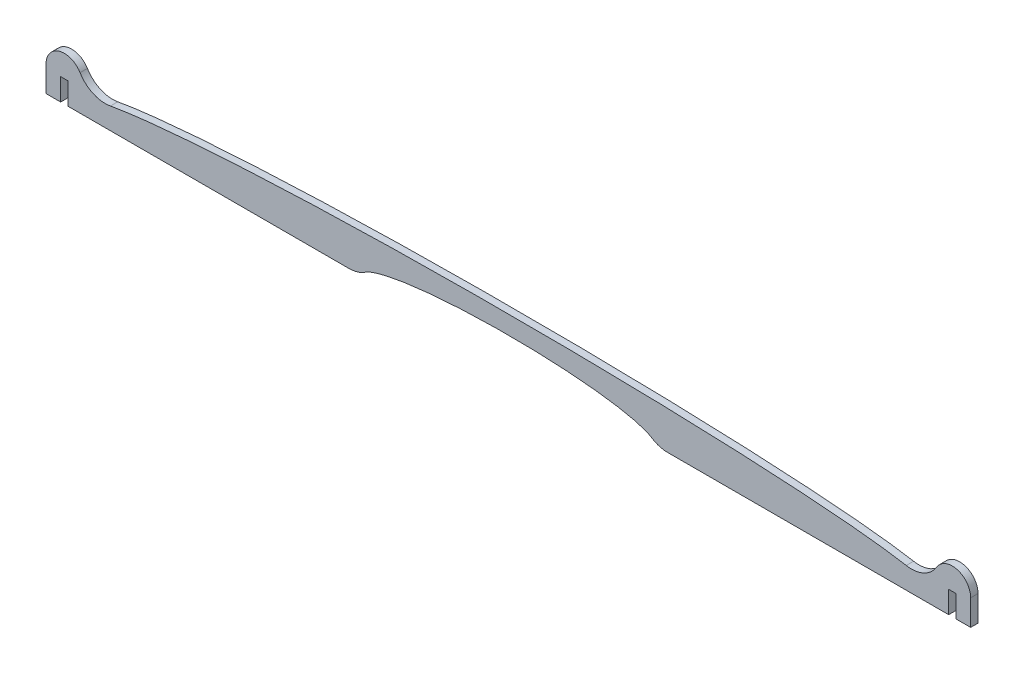
ISO-10303-21;
HEADER;
FILE_DESCRIPTION(('STEP AP214'),'2;1');
FILE_NAME('part.step','',(''),(''),'','','');
FILE_SCHEMA(('AUTOMOTIVE_DESIGN { 1 0 10303 214 1 1 1 1 }'));
ENDSEC;
DATA;
#1=APPLICATION_CONTEXT('core data for automotive mechanical design processes');
#2=APPLICATION_PROTOCOL_DEFINITION('international standard','automotive_design',2000,#1);
#3=PRODUCT_CONTEXT('',#1,'mechanical');
#4=PRODUCT('Part','Part','',(#3));
#5=PRODUCT_RELATED_PRODUCT_CATEGORY('part','',(#4));
#6=PRODUCT_DEFINITION_FORMATION('','',#4);
#7=PRODUCT_DEFINITION_CONTEXT('part definition',#1,'design');
#8=PRODUCT_DEFINITION('design','',#6,#7);
#9=PRODUCT_DEFINITION_SHAPE('','',#8);
#10=(LENGTH_UNIT() NAMED_UNIT(*) SI_UNIT(.MILLI.,.METRE.));
#11=(NAMED_UNIT(*) PLANE_ANGLE_UNIT() SI_UNIT($,.RADIAN.));
#12=(NAMED_UNIT(*) SI_UNIT($,.STERADIAN.) SOLID_ANGLE_UNIT());
#13=UNCERTAINTY_MEASURE_WITH_UNIT(LENGTH_MEASURE(1.E-05),#10,'distance_accuracy_value','');
#14=(GEOMETRIC_REPRESENTATION_CONTEXT(3) GLOBAL_UNCERTAINTY_ASSIGNED_CONTEXT((#13)) GLOBAL_UNIT_ASSIGNED_CONTEXT((#10,
#11,#12)) REPRESENTATION_CONTEXT('',''));
#15=CARTESIAN_POINT('',(0.,0.,0.));
#16=DIRECTION('',(0.,0.,1.));
#17=DIRECTION('',(1.,0.,0.));
#18=AXIS2_PLACEMENT_3D('',#15,#16,#17);
#19=CARTESIAN_POINT('',(0.,4.76250000000008,3.175));
#20=DIRECTION('',(0.,0.,1.));
#21=DIRECTION('',(-1.,0.,0.));
#22=AXIS2_PLACEMENT_3D('',#19,#20,#21);
#23=ELLIPSE('',#22,184.15,12.7);
#24=DIRECTION('',(0.,0.,-1.));
#25=VECTOR('',#24,1.);
#26=SURFACE_OF_LINEAR_EXTRUSION('',#23,#25);
#27=CARTESIAN_POINT('',(172.145584931808,9.27282378381999,3.175));
#28=VERTEX_POINT('',#27);
#29=CARTESIAN_POINT('',(-172.145584931808,9.27282378381973,3.175));
#30=VERTEX_POINT('',#29);
#31=EDGE_CURVE('E187',#28,#30,#23,.T.);
#32=ORIENTED_EDGE('',*,*,#31,.F.);
#33=DIRECTION('',(0.,0.,-1.));
#34=VECTOR('',#33,1.);
#35=CARTESIAN_POINT('',(172.145584931808,9.27282378381999,3.175));
#36=LINE('',#35,#34);
#37=CARTESIAN_POINT('',(172.145584931808,9.27282378381999,0.));
#38=VERTEX_POINT('',#37);
#39=EDGE_CURVE('E316',#28,#38,#36,.T.);
#40=ORIENTED_EDGE('',*,*,#39,.T.);
#41=CARTESIAN_POINT('',(0.,4.76250000000008,0.));
#42=DIRECTION('',(0.,0.,1.));
#43=DIRECTION('',(-1.,0.,0.));
#44=AXIS2_PLACEMENT_3D('',#41,#42,#43);
#45=ELLIPSE('',#44,184.15,12.7);
#46=CARTESIAN_POINT('',(-172.145584931808,9.27282378381973,0.));
#47=VERTEX_POINT('',#46);
#48=EDGE_CURVE('E330',#38,#47,#45,.T.);
#49=ORIENTED_EDGE('',*,*,#48,.T.);
#50=DIRECTION('',(0.,0.,-1.));
#51=VECTOR('',#50,1.);
#52=CARTESIAN_POINT('',(-172.145584931808,9.27282378381973,0.));
#53=LINE('',#52,#51);
#54=EDGE_CURVE('E314',#47,#30,#53,.F.);
#55=ORIENTED_EDGE('',*,*,#54,.T.);
#56=EDGE_LOOP('',(#32,#40,#49,#55));
#57=FACE_BOUND('',#56,.T.);
#58=ADVANCED_FACE('F36',(#57),#26,.F.);
#59=CARTESIAN_POINT('',(-192.0875,11.1125,3.175));
#60=DIRECTION('',(0.,0.,-1.));
#61=DIRECTION('',(-1.,0.,0.));
#62=AXIS2_PLACEMENT_3D('',#59,#60,#61);
#63=CYLINDRICAL_SURFACE('',#62,7.93749999999999);
#64=CARTESIAN_POINT('',(-192.0875,11.1125,3.175));
#65=DIRECTION('',(0.,0.,1.));
#66=DIRECTION('',(-1.,0.,0.));
#67=AXIS2_PLACEMENT_3D('',#64,#65,#66);
#68=CIRCLE('',#67,7.93749999999999);
#69=CARTESIAN_POINT('',(-185.289985800573,15.2110005744278,3.175));
#70=VERTEX_POINT('',#69);
#71=CARTESIAN_POINT('',(-200.025,11.1124999999999,3.175));
#72=VERTEX_POINT('',#71);
#73=EDGE_CURVE('E175',#70,#72,#68,.T.);
#74=ORIENTED_EDGE('',*,*,#73,.F.);
#75=DIRECTION('',(0.,0.,-1.));
#76=VECTOR('',#75,1.);
#77=CARTESIAN_POINT('',(-185.289985800573,15.2110005744278,3.175));
#78=LINE('',#77,#76);
#79=CARTESIAN_POINT('',(-185.289985800573,15.2110005744278,0.));
#80=VERTEX_POINT('',#79);
#81=EDGE_CURVE('E320',#70,#80,#78,.T.);
#82=ORIENTED_EDGE('',*,*,#81,.T.);
#83=CARTESIAN_POINT('',(-192.0875,11.1125,0.));
#84=DIRECTION('',(0.,0.,1.));
#85=DIRECTION('',(-1.,0.,0.));
#86=AXIS2_PLACEMENT_3D('',#83,#84,#85);
#87=CIRCLE('',#86,7.93749999999999);
#88=CARTESIAN_POINT('',(-200.025,11.1124999999999,0.));
#89=VERTEX_POINT('',#88);
#90=EDGE_CURVE('E193',#80,#89,#87,.T.);
#91=ORIENTED_EDGE('',*,*,#90,.T.);
#92=DIRECTION('',(0.,0.,-1.));
#93=VECTOR('',#92,1.);
#94=CARTESIAN_POINT('',(-200.025,11.1124999999999,3.175));
#95=LINE('',#94,#93);
#96=EDGE_CURVE('E190',#72,#89,#95,.T.);
#97=ORIENTED_EDGE('',*,*,#96,.F.);
#98=EDGE_LOOP('',(#74,#82,#91,#97));
#99=FACE_BOUND('',#98,.T.);
#100=ADVANCED_FACE('F191',(#99),#63,.T.);
#101=CARTESIAN_POINT('',(-200.025,0.,3.175));
#102=DIRECTION('',(1.,0.,0.));
#103=DIRECTION('',(0.,0.,-1.));
#104=AXIS2_PLACEMENT_3D('',#101,#102,#103);
#105=PLANE('',#104);
#106=DIRECTION('',(0.,-1.,0.));
#107=VECTOR('',#106,1.);
#108=CARTESIAN_POINT('',(-200.025,0.,0.));
#109=LINE('',#108,#107);
#110=CARTESIAN_POINT('',(-200.025,0.,0.));
#111=VERTEX_POINT('',#110);
#112=EDGE_CURVE('E356',#89,#111,#109,.T.);
#113=ORIENTED_EDGE('',*,*,#112,.T.);
#114=DIRECTION('',(0.,0.,-1.));
#115=VECTOR('',#114,1.);
#116=CARTESIAN_POINT('',(-200.025,0.,3.175));
#117=LINE('',#116,#115);
#118=CARTESIAN_POINT('',(-200.025,0.,3.175));
#119=VERTEX_POINT('',#118);
#120=EDGE_CURVE('E197',#119,#111,#117,.T.);
#121=ORIENTED_EDGE('',*,*,#120,.F.);
#122=DIRECTION('',(0.,-1.,0.));
#123=VECTOR('',#122,1.);
#124=CARTESIAN_POINT('',(-200.025,0.,3.175));
#125=LINE('',#124,#123);
#126=EDGE_CURVE('E180',#72,#119,#125,.T.);
#127=ORIENTED_EDGE('',*,*,#126,.F.);
#128=ORIENTED_EDGE('',*,*,#96,.T.);
#129=EDGE_LOOP('',(#113,#121,#127,#128));
#130=FACE_BOUND('',#129,.T.);
#131=ADVANCED_FACE('F199',(#130),#105,.F.);
#132=CARTESIAN_POINT('',(-200.025,0.,3.175));
#133=DIRECTION('',(0.,1.,0.));
#134=DIRECTION('',(-1.,0.,0.));
#135=AXIS2_PLACEMENT_3D('',#132,#133,#134);
#136=PLANE('',#135);
#137=DIRECTION('',(1.,0.,0.));
#138=VECTOR('',#137,1.);
#139=CARTESIAN_POINT('',(-200.025,0.,0.));
#140=LINE('',#139,#138);
#141=CARTESIAN_POINT('',(-193.675,0.,0.));
#142=VERTEX_POINT('',#141);
#143=EDGE_CURVE('E358',#111,#142,#140,.T.);
#144=ORIENTED_EDGE('',*,*,#143,.T.);
#145=DIRECTION('',(0.,0.,-1.));
#146=VECTOR('',#145,1.);
#147=CARTESIAN_POINT('',(-193.675,0.,3.175));
#148=LINE('',#147,#146);
#149=CARTESIAN_POINT('',(-193.675,0.,3.175));
#150=VERTEX_POINT('',#149);
#151=EDGE_CURVE('E294',#150,#142,#148,.T.);
#152=ORIENTED_EDGE('',*,*,#151,.F.);
#153=DIRECTION('',(1.,0.,0.));
#154=VECTOR('',#153,1.);
#155=CARTESIAN_POINT('',(-200.025,0.,3.175));
#156=LINE('',#155,#154);
#157=EDGE_CURVE('E202',#119,#150,#156,.T.);
#158=ORIENTED_EDGE('',*,*,#157,.F.);
#159=ORIENTED_EDGE('',*,*,#120,.T.);
#160=EDGE_LOOP('',(#144,#152,#158,#159));
#161=FACE_BOUND('',#160,.T.);
#162=ADVANCED_FACE('F242',(#161),#136,.F.);
#163=CARTESIAN_POINT('',(-193.675,0.,3.175));
#164=DIRECTION('',(-1.,0.,0.));
#165=DIRECTION('',(0.,0.,1.));
#166=AXIS2_PLACEMENT_3D('',#163,#164,#165);
#167=PLANE('',#166);
#168=DIRECTION('',(0.,1.,0.));
#169=VECTOR('',#168,1.);
#170=CARTESIAN_POINT('',(-193.675,0.,0.));
#171=LINE('',#170,#169);
#172=CARTESIAN_POINT('',(-193.675,9.52500000000022,0.));
#173=VERTEX_POINT('',#172);
#174=EDGE_CURVE('E360',#142,#173,#171,.T.);
#175=ORIENTED_EDGE('',*,*,#174,.T.);
#176=DIRECTION('',(0.,0.,-1.));
#177=VECTOR('',#176,1.);
#178=CARTESIAN_POINT('',(-193.675,9.52500000000022,3.175));
#179=LINE('',#178,#177);
#180=CARTESIAN_POINT('',(-193.675,9.52500000000022,3.175));
#181=VERTEX_POINT('',#180);
#182=EDGE_CURVE('E291',#181,#173,#179,.T.);
#183=ORIENTED_EDGE('',*,*,#182,.F.);
#184=DIRECTION('',(0.,1.,0.));
#185=VECTOR('',#184,1.);
#186=CARTESIAN_POINT('',(-193.675,0.,3.175));
#187=LINE('',#186,#185);
#188=EDGE_CURVE('E204',#150,#181,#187,.T.);
#189=ORIENTED_EDGE('',*,*,#188,.F.);
#190=ORIENTED_EDGE('',*,*,#151,.T.);
#191=EDGE_LOOP('',(#175,#183,#189,#190));
#192=FACE_BOUND('',#191,.T.);
#193=ADVANCED_FACE('F238',(#192),#167,.F.);
#194=CARTESIAN_POINT('',(-193.675,9.52500000000022,3.175));
#195=DIRECTION('',(0.,1.,0.));
#196=DIRECTION('',(-1.,0.,0.));
#197=AXIS2_PLACEMENT_3D('',#194,#195,#196);
#198=PLANE('',#197);
#199=DIRECTION('',(1.,0.,0.));
#200=VECTOR('',#199,1.);
#201=CARTESIAN_POINT('',(-193.675,9.52500000000022,0.));
#202=LINE('',#201,#200);
#203=CARTESIAN_POINT('',(-190.5,9.525,0.));
#204=VERTEX_POINT('',#203);
#205=EDGE_CURVE('E362',#173,#204,#202,.T.);
#206=ORIENTED_EDGE('',*,*,#205,.T.);
#207=DIRECTION('',(0.,0.,-1.));
#208=VECTOR('',#207,1.);
#209=CARTESIAN_POINT('',(-190.5,9.525,3.175));
#210=LINE('',#209,#208);
#211=CARTESIAN_POINT('',(-190.5,9.525,3.175));
#212=VERTEX_POINT('',#211);
#213=EDGE_CURVE('E288',#212,#204,#210,.T.);
#214=ORIENTED_EDGE('',*,*,#213,.F.);
#215=DIRECTION('',(1.,0.,0.));
#216=VECTOR('',#215,1.);
#217=CARTESIAN_POINT('',(-193.675,9.52500000000022,3.175));
#218=LINE('',#217,#216);
#219=EDGE_CURVE('E209',#181,#212,#218,.T.);
#220=ORIENTED_EDGE('',*,*,#219,.F.);
#221=ORIENTED_EDGE('',*,*,#182,.T.);
#222=EDGE_LOOP('',(#206,#214,#220,#221));
#223=FACE_BOUND('',#222,.T.);
#224=ADVANCED_FACE('F234',(#223),#198,.F.);
#225=CARTESIAN_POINT('',(-190.5,9.525,3.175));
#226=DIRECTION('',(1.,0.,0.));
#227=DIRECTION('',(0.,1.,0.));
#228=AXIS2_PLACEMENT_3D('',#225,#226,#227);
#229=PLANE('',#228);
#230=DIRECTION('',(0.,-1.,0.));
#231=VECTOR('',#230,1.);
#232=CARTESIAN_POINT('',(-190.5,9.525,0.));
#233=LINE('',#232,#231);
#234=CARTESIAN_POINT('',(-190.5,0.,0.));
#235=VERTEX_POINT('',#234);
#236=EDGE_CURVE('E364',#204,#235,#233,.T.);
#237=ORIENTED_EDGE('',*,*,#236,.T.);
#238=DIRECTION('',(0.,0.,-1.));
#239=VECTOR('',#238,1.);
#240=CARTESIAN_POINT('',(-190.5,0.,3.175));
#241=LINE('',#240,#239);
#242=CARTESIAN_POINT('',(-190.5,0.,3.175));
#243=VERTEX_POINT('',#242);
#244=EDGE_CURVE('E285',#243,#235,#241,.T.);
#245=ORIENTED_EDGE('',*,*,#244,.F.);
#246=DIRECTION('',(0.,-1.,0.));
#247=VECTOR('',#246,1.);
#248=CARTESIAN_POINT('',(-190.5,9.525,3.175));
#249=LINE('',#248,#247);
#250=EDGE_CURVE('E211',#212,#243,#249,.T.);
#251=ORIENTED_EDGE('',*,*,#250,.F.);
#252=ORIENTED_EDGE('',*,*,#213,.T.);
#253=EDGE_LOOP('',(#237,#245,#251,#252));
#254=FACE_BOUND('',#253,.T.);
#255=ADVANCED_FACE('F231',(#254),#229,.F.);
#256=CARTESIAN_POINT('',(-190.5,0.,3.175));
#257=DIRECTION('',(0.,1.,0.));
#258=DIRECTION('',(0.,0.,1.));
#259=AXIS2_PLACEMENT_3D('',#256,#257,#258);
#260=PLANE('',#259);
#261=DIRECTION('',(1.,0.,0.));
#262=VECTOR('',#261,1.);
#263=CARTESIAN_POINT('',(-190.5,0.,0.));
#264=LINE('',#263,#262);
#265=CARTESIAN_POINT('',(-68.9324959799146,0.,0.));
#266=VERTEX_POINT('',#265);
#267=EDGE_CURVE('E366',#235,#266,#264,.T.);
#268=ORIENTED_EDGE('',*,*,#267,.T.);
#269=DIRECTION('',(0.,0.,-1.));
#270=VECTOR('',#269,1.);
#271=CARTESIAN_POINT('',(-68.9324959799145,0.,3.175));
#272=LINE('',#271,#270);
#273=CARTESIAN_POINT('',(-68.9324959799146,0.,3.175));
#274=VERTEX_POINT('',#273);
#275=EDGE_CURVE('E59',#266,#274,#272,.F.);
#276=ORIENTED_EDGE('',*,*,#275,.T.);
#277=DIRECTION('',(1.,0.,0.));
#278=VECTOR('',#277,1.);
#279=CARTESIAN_POINT('',(-190.5,0.,3.175));
#280=LINE('',#279,#278);
#281=EDGE_CURVE('E213',#243,#274,#280,.T.);
#282=ORIENTED_EDGE('',*,*,#281,.F.);
#283=ORIENTED_EDGE('',*,*,#244,.T.);
#284=EDGE_LOOP('',(#268,#276,#282,#283));
#285=FACE_BOUND('',#284,.T.);
#286=ADVANCED_FACE('F226',(#285),#260,.F.);
#287=CARTESIAN_POINT('',(0.,0.,3.175));
#288=DIRECTION('',(0.,0.,-1.));
#289=DIRECTION('',(-1.,0.,0.));
#290=AXIS2_PLACEMENT_3D('',#287,#288,#289);
#291=ELLIPSE('',#290,63.5,9.525);
#292=DIRECTION('',(0.,0.,-1.));
#293=VECTOR('',#292,1.);
#294=SURFACE_OF_LINEAR_EXTRUSION('',#291,#293);
#295=CARTESIAN_POINT('',(0.,0.,0.));
#296=DIRECTION('',(0.,0.,-1.));
#297=DIRECTION('',(-1.,0.,0.));
#298=AXIS2_PLACEMENT_3D('',#295,#296,#297);
#299=ELLIPSE('',#298,63.5,9.525);
#300=CARTESIAN_POINT('',(-61.9270250788543,2.10691841556961,0.));
#301=VERTEX_POINT('',#300);
#302=CARTESIAN_POINT('',(61.9270250788543,2.1069184155696,0.));
#303=VERTEX_POINT('',#302);
#304=EDGE_CURVE('E368',#301,#303,#299,.T.);
#305=ORIENTED_EDGE('',*,*,#304,.T.);
#306=DIRECTION('',(0.,0.,-1.));
#307=VECTOR('',#306,1.);
#308=CARTESIAN_POINT('',(61.9270250788543,2.1069184155696,0.));
#309=LINE('',#308,#307);
#310=CARTESIAN_POINT('',(61.9270250788543,2.1069184155696,3.175));
#311=VERTEX_POINT('',#310);
#312=EDGE_CURVE('E307',#303,#311,#309,.F.);
#313=ORIENTED_EDGE('',*,*,#312,.T.);
#314=CARTESIAN_POINT('',(-61.9270250788543,2.10691841556961,3.175));
#315=VERTEX_POINT('',#314);
#316=EDGE_CURVE('E215',#315,#311,#291,.T.);
#317=ORIENTED_EDGE('',*,*,#316,.F.);
#318=DIRECTION('',(0.,0.,-1.));
#319=VECTOR('',#318,1.);
#320=CARTESIAN_POINT('',(-61.9270250788543,2.10691841556961,3.175));
#321=LINE('',#320,#319);
#322=EDGE_CURVE('E304',#315,#301,#321,.T.);
#323=ORIENTED_EDGE('',*,*,#322,.T.);
#324=EDGE_LOOP('',(#305,#313,#317,#323));
#325=FACE_BOUND('',#324,.T.);
#326=ADVANCED_FACE('F221',(#325),#294,.F.);
#327=CARTESIAN_POINT('',(190.5,0.,3.175));
#328=DIRECTION('',(0.,1.,0.));
#329=DIRECTION('',(-1.,0.,0.));
#330=AXIS2_PLACEMENT_3D('',#327,#328,#329);
#331=PLANE('',#330);
#332=DIRECTION('',(1.,0.,0.));
#333=VECTOR('',#332,1.);
#334=CARTESIAN_POINT('',(190.5,0.,3.175));
#335=LINE('',#334,#333);
#336=CARTESIAN_POINT('',(68.9324959799145,0.,3.175));
#337=VERTEX_POINT('',#336);
#338=CARTESIAN_POINT('',(190.5,0.,3.175));
#339=VERTEX_POINT('',#338);
#340=EDGE_CURVE('E218',#337,#339,#335,.T.);
#341=ORIENTED_EDGE('',*,*,#340,.F.);
#342=DIRECTION('',(0.,0.,-1.));
#343=VECTOR('',#342,1.);
#344=CARTESIAN_POINT('',(68.9324959799145,0.,3.175));
#345=LINE('',#344,#343);
#346=CARTESIAN_POINT('',(68.9324959799145,0.,0.));
#347=VERTEX_POINT('',#346);
#348=EDGE_CURVE('E196',#337,#347,#345,.T.);
#349=ORIENTED_EDGE('',*,*,#348,.T.);
#350=DIRECTION('',(1.,0.,0.));
#351=VECTOR('',#350,1.);
#352=CARTESIAN_POINT('',(190.5,0.,0.));
#353=LINE('',#352,#351);
#354=CARTESIAN_POINT('',(190.5,0.,0.));
#355=VERTEX_POINT('',#354);
#356=EDGE_CURVE('E371',#347,#355,#353,.T.);
#357=ORIENTED_EDGE('',*,*,#356,.T.);
#358=DIRECTION('',(0.,0.,-1.));
#359=VECTOR('',#358,1.);
#360=CARTESIAN_POINT('',(190.5,0.,3.175));
#361=LINE('',#360,#359);
#362=EDGE_CURVE('E282',#339,#355,#361,.T.);
#363=ORIENTED_EDGE('',*,*,#362,.F.);
#364=EDGE_LOOP('',(#341,#349,#357,#363));
#365=FACE_BOUND('',#364,.T.);
#366=ADVANCED_FACE('F225',(#365),#331,.F.);
#367=CARTESIAN_POINT('',(190.5,9.52500000000022,3.175));
#368=DIRECTION('',(-1.,0.,0.));
#369=DIRECTION('',(0.,-1.,0.));
#370=AXIS2_PLACEMENT_3D('',#367,#368,#369);
#371=PLANE('',#370);
#372=DIRECTION('',(0.,1.,0.));
#373=VECTOR('',#372,1.);
#374=CARTESIAN_POINT('',(190.5,9.52500000000022,0.));
#375=LINE('',#374,#373);
#376=CARTESIAN_POINT('',(190.5,9.52500000000022,0.));
#377=VERTEX_POINT('',#376);
#378=EDGE_CURVE('E373',#355,#377,#375,.T.);
#379=ORIENTED_EDGE('',*,*,#378,.T.);
#380=DIRECTION('',(0.,0.,-1.));
#381=VECTOR('',#380,1.);
#382=CARTESIAN_POINT('',(190.5,9.52500000000022,3.175));
#383=LINE('',#382,#381);
#384=CARTESIAN_POINT('',(190.5,9.52500000000022,3.175));
#385=VERTEX_POINT('',#384);
#386=EDGE_CURVE('E279',#385,#377,#383,.T.);
#387=ORIENTED_EDGE('',*,*,#386,.F.);
#388=DIRECTION('',(0.,1.,0.));
#389=VECTOR('',#388,1.);
#390=CARTESIAN_POINT('',(190.5,9.52500000000022,3.175));
#391=LINE('',#390,#389);
#392=EDGE_CURVE('E426',#339,#385,#391,.T.);
#393=ORIENTED_EDGE('',*,*,#392,.F.);
#394=ORIENTED_EDGE('',*,*,#362,.T.);
#395=EDGE_LOOP('',(#379,#387,#393,#394));
#396=FACE_BOUND('',#395,.T.);
#397=ADVANCED_FACE('F407',(#396),#371,.F.);
#398=CARTESIAN_POINT('',(193.675,9.52500000000022,3.175));
#399=DIRECTION('',(0.,1.,0.));
#400=DIRECTION('',(0.,0.,1.));
#401=AXIS2_PLACEMENT_3D('',#398,#399,#400);
#402=PLANE('',#401);
#403=DIRECTION('',(1.,0.,0.));
#404=VECTOR('',#403,1.);
#405=CARTESIAN_POINT('',(193.675,9.52500000000022,0.));
#406=LINE('',#405,#404);
#407=CARTESIAN_POINT('',(193.675,9.52500000000022,0.));
#408=VERTEX_POINT('',#407);
#409=EDGE_CURVE('E375',#377,#408,#406,.T.);
#410=ORIENTED_EDGE('',*,*,#409,.T.);
#411=DIRECTION('',(0.,0.,-1.));
#412=VECTOR('',#411,1.);
#413=CARTESIAN_POINT('',(193.675,9.52500000000022,3.175));
#414=LINE('',#413,#412);
#415=CARTESIAN_POINT('',(193.675,9.52500000000022,3.175));
#416=VERTEX_POINT('',#415);
#417=EDGE_CURVE('E276',#416,#408,#414,.T.);
#418=ORIENTED_EDGE('',*,*,#417,.F.);
#419=DIRECTION('',(1.,0.,0.));
#420=VECTOR('',#419,1.);
#421=CARTESIAN_POINT('',(193.675,9.52500000000022,3.175));
#422=LINE('',#421,#420);
#423=EDGE_CURVE('E422',#385,#416,#422,.T.);
#424=ORIENTED_EDGE('',*,*,#423,.F.);
#425=ORIENTED_EDGE('',*,*,#386,.T.);
#426=EDGE_LOOP('',(#410,#418,#424,#425));
#427=FACE_BOUND('',#426,.T.);
#428=ADVANCED_FACE('F404',(#427),#402,.F.);
#429=CARTESIAN_POINT('',(193.675,0.,3.175));
#430=DIRECTION('',(1.,0.,0.));
#431=DIRECTION('',(0.,0.,-1.));
#432=AXIS2_PLACEMENT_3D('',#429,#430,#431);
#433=PLANE('',#432);
#434=DIRECTION('',(0.,-1.,0.));
#435=VECTOR('',#434,1.);
#436=CARTESIAN_POINT('',(193.675,0.,0.));
#437=LINE('',#436,#435);
#438=CARTESIAN_POINT('',(193.675,0.,0.));
#439=VERTEX_POINT('',#438);
#440=EDGE_CURVE('E377',#408,#439,#437,.T.);
#441=ORIENTED_EDGE('',*,*,#440,.T.);
#442=DIRECTION('',(0.,0.,-1.));
#443=VECTOR('',#442,1.);
#444=CARTESIAN_POINT('',(193.675,0.,3.175));
#445=LINE('',#444,#443);
#446=CARTESIAN_POINT('',(193.675,0.,3.175));
#447=VERTEX_POINT('',#446);
#448=EDGE_CURVE('E273',#447,#439,#445,.T.);
#449=ORIENTED_EDGE('',*,*,#448,.F.);
#450=DIRECTION('',(0.,-1.,0.));
#451=VECTOR('',#450,1.);
#452=CARTESIAN_POINT('',(193.675,0.,3.175));
#453=LINE('',#452,#451);
#454=EDGE_CURVE('E424',#416,#447,#453,.T.);
#455=ORIENTED_EDGE('',*,*,#454,.F.);
#456=ORIENTED_EDGE('',*,*,#417,.T.);
#457=EDGE_LOOP('',(#441,#449,#455,#456));
#458=FACE_BOUND('',#457,.T.);
#459=ADVANCED_FACE('F401',(#458),#433,.F.);
#460=CARTESIAN_POINT('',(200.025,0.,3.175));
#461=DIRECTION('',(0.,1.,0.));
#462=DIRECTION('',(-1.,0.,0.));
#463=AXIS2_PLACEMENT_3D('',#460,#461,#462);
#464=PLANE('',#463);
#465=DIRECTION('',(1.,0.,0.));
#466=VECTOR('',#465,1.);
#467=CARTESIAN_POINT('',(200.025,0.,0.));
#468=LINE('',#467,#466);
#469=CARTESIAN_POINT('',(200.025,0.,0.));
#470=VERTEX_POINT('',#469);
#471=EDGE_CURVE('E263',#439,#470,#468,.T.);
#472=ORIENTED_EDGE('',*,*,#471,.T.);
#473=DIRECTION('',(0.,0.,-1.));
#474=VECTOR('',#473,1.);
#475=CARTESIAN_POINT('',(200.025,0.,3.175));
#476=LINE('',#475,#474);
#477=CARTESIAN_POINT('',(200.025,0.,3.175));
#478=VERTEX_POINT('',#477);
#479=EDGE_CURVE('E269',#478,#470,#476,.T.);
#480=ORIENTED_EDGE('',*,*,#479,.F.);
#481=DIRECTION('',(1.,0.,0.));
#482=VECTOR('',#481,1.);
#483=CARTESIAN_POINT('',(200.025,0.,3.175));
#484=LINE('',#483,#482);
#485=EDGE_CURVE('E351',#447,#478,#484,.T.);
#486=ORIENTED_EDGE('',*,*,#485,.F.);
#487=ORIENTED_EDGE('',*,*,#448,.T.);
#488=EDGE_LOOP('',(#472,#480,#486,#487));
#489=FACE_BOUND('',#488,.T.);
#490=ADVANCED_FACE('F381',(#489),#464,.F.);
#491=CARTESIAN_POINT('',(200.025,0.,3.175));
#492=DIRECTION('',(-1.,0.,0.));
#493=DIRECTION('',(0.,0.,1.));
#494=AXIS2_PLACEMENT_3D('',#491,#492,#493);
#495=PLANE('',#494);
#496=DIRECTION('',(0.,1.,0.));
#497=VECTOR('',#496,1.);
#498=CARTESIAN_POINT('',(200.025,0.,0.));
#499=LINE('',#498,#497);
#500=CARTESIAN_POINT('',(200.025,11.1124999999999,0.));
#501=VERTEX_POINT('',#500);
#502=EDGE_CURVE('E259',#470,#501,#499,.T.);
#503=ORIENTED_EDGE('',*,*,#502,.T.);
#504=DIRECTION('',(0.,0.,-1.));
#505=VECTOR('',#504,1.);
#506=CARTESIAN_POINT('',(200.025,11.1124999999999,3.175));
#507=LINE('',#506,#505);
#508=CARTESIAN_POINT('',(200.025,11.1124999999999,3.175));
#509=VERTEX_POINT('',#508);
#510=EDGE_CURVE('E267',#509,#501,#507,.T.);
#511=ORIENTED_EDGE('',*,*,#510,.F.);
#512=DIRECTION('',(0.,1.,0.));
#513=VECTOR('',#512,1.);
#514=CARTESIAN_POINT('',(200.025,0.,3.175));
#515=LINE('',#514,#513);
#516=EDGE_CURVE('E348',#478,#509,#515,.T.);
#517=ORIENTED_EDGE('',*,*,#516,.F.);
#518=ORIENTED_EDGE('',*,*,#479,.T.);
#519=EDGE_LOOP('',(#503,#511,#517,#518));
#520=FACE_BOUND('',#519,.T.);
#521=ADVANCED_FACE('F387',(#520),#495,.F.);
#522=CARTESIAN_POINT('',(192.0875,11.1125,3.175));
#523=DIRECTION('',(0.,0.,-1.));
#524=DIRECTION('',(-1.,0.,0.));
#525=AXIS2_PLACEMENT_3D('',#522,#523,#524);
#526=CYLINDRICAL_SURFACE('',#525,7.93749999999999);
#527=CARTESIAN_POINT('',(192.0875,11.1125,0.));
#528=DIRECTION('',(0.,0.,1.));
#529=DIRECTION('',(1.,0.,0.));
#530=AXIS2_PLACEMENT_3D('',#527,#528,#529);
#531=CIRCLE('',#530,7.93749999999999);
#532=CARTESIAN_POINT('',(185.289985800573,15.2110005744279,0.));
#533=VERTEX_POINT('',#532);
#534=EDGE_CURVE('E257',#501,#533,#531,.T.);
#535=ORIENTED_EDGE('',*,*,#534,.T.);
#536=DIRECTION('',(0.,0.,-1.));
#537=VECTOR('',#536,1.);
#538=CARTESIAN_POINT('',(185.289985800573,15.2110005744279,3.175));
#539=LINE('',#538,#537);
#540=CARTESIAN_POINT('',(185.289985800573,15.2110005744279,3.175));
#541=VERTEX_POINT('',#540);
#542=EDGE_CURVE('E51',#533,#541,#539,.F.);
#543=ORIENTED_EDGE('',*,*,#542,.T.);
#544=CARTESIAN_POINT('',(192.0875,11.1125,3.175));
#545=DIRECTION('',(0.,0.,1.));
#546=DIRECTION('',(1.,0.,0.));
#547=AXIS2_PLACEMENT_3D('',#544,#545,#546);
#548=CIRCLE('',#547,7.93749999999999);
#549=EDGE_CURVE('E270',#509,#541,#548,.T.);
#550=ORIENTED_EDGE('',*,*,#549,.F.);
#551=ORIENTED_EDGE('',*,*,#510,.T.);
#552=EDGE_LOOP('',(#535,#543,#550,#551));
#553=FACE_BOUND('',#552,.T.);
#554=ADVANCED_FACE('F388',(#553),#526,.T.);
#555=CARTESIAN_POINT('',(0.,4.76250000000008,3.175));
#556=DIRECTION('',(0.,0.,1.));
#557=DIRECTION('',(1.,0.,0.));
#558=AXIS2_PLACEMENT_3D('',#555,#556,#557);
#559=PLANE('',#558);
#560=ORIENTED_EDGE('',*,*,#316,.T.);
#561=CARTESIAN_POINT('',(68.9324959799145,12.7,3.175));
#562=DIRECTION('',(0.,0.,1.));
#563=DIRECTION('',(1.,0.,0.));
#564=AXIS2_PLACEMENT_3D('',#561,#562,#563);
#565=CIRCLE('',#564,12.7);
#566=EDGE_CURVE('E311',#311,#337,#565,.T.);
#567=ORIENTED_EDGE('',*,*,#566,.T.);
#568=ORIENTED_EDGE('',*,*,#340,.T.);
#569=ORIENTED_EDGE('',*,*,#392,.T.);
#570=ORIENTED_EDGE('',*,*,#423,.T.);
#571=ORIENTED_EDGE('',*,*,#454,.T.);
#572=ORIENTED_EDGE('',*,*,#485,.T.);
#573=ORIENTED_EDGE('',*,*,#516,.T.);
#574=ORIENTED_EDGE('',*,*,#549,.T.);
#575=CARTESIAN_POINT('',(174.413963081489,21.7686014935125,3.175));
#576=DIRECTION('',(0.,0.,1.));
#577=DIRECTION('',(1.,0.,0.));
#578=AXIS2_PLACEMENT_3D('',#575,#576,#577);
#579=CIRCLE('',#578,12.7);
#580=EDGE_CURVE('E324',#541,#28,#579,.F.);
#581=ORIENTED_EDGE('',*,*,#580,.T.);
#582=ORIENTED_EDGE('',*,*,#31,.T.);
#583=CARTESIAN_POINT('',(-174.413963081489,21.7686014935122,3.175));
#584=DIRECTION('',(0.,0.,1.));
#585=DIRECTION('',(1.,0.,0.));
#586=AXIS2_PLACEMENT_3D('',#583,#584,#585);
#587=CIRCLE('',#586,12.7);
#588=EDGE_CURVE('E11',#30,#70,#587,.F.);
#589=ORIENTED_EDGE('',*,*,#588,.T.);
#590=ORIENTED_EDGE('',*,*,#73,.T.);
#591=ORIENTED_EDGE('',*,*,#126,.T.);
#592=ORIENTED_EDGE('',*,*,#157,.T.);
#593=ORIENTED_EDGE('',*,*,#188,.T.);
#594=ORIENTED_EDGE('',*,*,#219,.T.);
#595=ORIENTED_EDGE('',*,*,#250,.T.);
#596=ORIENTED_EDGE('',*,*,#281,.T.);
#597=CARTESIAN_POINT('',(-68.9324959799145,12.7,3.175));
#598=DIRECTION('',(0.,0.,1.));
#599=DIRECTION('',(1.,0.,0.));
#600=AXIS2_PLACEMENT_3D('',#597,#598,#599);
#601=CIRCLE('',#600,12.7);
#602=EDGE_CURVE('E309',#274,#315,#601,.T.);
#603=ORIENTED_EDGE('',*,*,#602,.T.);
#604=EDGE_LOOP('',(#560,#567,#568,#569,#570,#571,#572,#573,#574,#581,#582,#589,#590,#591,#592,
#593,#594,#595,#596,#603));
#605=FACE_BOUND('',#604,.T.);
#606=ADVANCED_FACE('F178',(#605),#559,.T.);
#607=CARTESIAN_POINT('',(0.,4.76250000000008,0.));
#608=DIRECTION('',(0.,0.,1.));
#609=DIRECTION('',(1.,0.,0.));
#610=AXIS2_PLACEMENT_3D('',#607,#608,#609);
#611=PLANE('',#610);
#612=ORIENTED_EDGE('',*,*,#356,.F.);
#613=CARTESIAN_POINT('',(68.9324959799145,12.7,0.));
#614=DIRECTION('',(0.,0.,1.));
#615=DIRECTION('',(1.,0.,0.));
#616=AXIS2_PLACEMENT_3D('',#613,#614,#615);
#617=CIRCLE('',#616,12.7);
#618=EDGE_CURVE('E302',#347,#303,#617,.F.);
#619=ORIENTED_EDGE('',*,*,#618,.T.);
#620=ORIENTED_EDGE('',*,*,#304,.F.);
#621=CARTESIAN_POINT('',(-68.9324959799145,12.7,0.));
#622=DIRECTION('',(0.,0.,1.));
#623=DIRECTION('',(1.,0.,0.));
#624=AXIS2_PLACEMENT_3D('',#621,#622,#623);
#625=CIRCLE('',#624,12.7);
#626=EDGE_CURVE('E300',#301,#266,#625,.F.);
#627=ORIENTED_EDGE('',*,*,#626,.T.);
#628=ORIENTED_EDGE('',*,*,#267,.F.);
#629=ORIENTED_EDGE('',*,*,#236,.F.);
#630=ORIENTED_EDGE('',*,*,#205,.F.);
#631=ORIENTED_EDGE('',*,*,#174,.F.);
#632=ORIENTED_EDGE('',*,*,#143,.F.);
#633=ORIENTED_EDGE('',*,*,#112,.F.);
#634=ORIENTED_EDGE('',*,*,#90,.F.);
#635=CARTESIAN_POINT('',(-174.413963081489,21.7686014935122,0.));
#636=DIRECTION('',(0.,0.,1.));
#637=DIRECTION('',(1.,0.,0.));
#638=AXIS2_PLACEMENT_3D('',#635,#636,#637);
#639=CIRCLE('',#638,12.7);
#640=EDGE_CURVE('E44',#80,#47,#639,.T.);
#641=ORIENTED_EDGE('',*,*,#640,.T.);
#642=ORIENTED_EDGE('',*,*,#48,.F.);
#643=CARTESIAN_POINT('',(174.413963081489,21.7686014935125,0.));
#644=DIRECTION('',(0.,0.,1.));
#645=DIRECTION('',(1.,0.,0.));
#646=AXIS2_PLACEMENT_3D('',#643,#644,#645);
#647=CIRCLE('',#646,12.7);
#648=EDGE_CURVE('E322',#38,#533,#647,.T.);
#649=ORIENTED_EDGE('',*,*,#648,.T.);
#650=ORIENTED_EDGE('',*,*,#534,.F.);
#651=ORIENTED_EDGE('',*,*,#502,.F.);
#652=ORIENTED_EDGE('',*,*,#471,.F.);
#653=ORIENTED_EDGE('',*,*,#440,.F.);
#654=ORIENTED_EDGE('',*,*,#409,.F.);
#655=ORIENTED_EDGE('',*,*,#378,.F.);
#656=EDGE_LOOP('',(#612,#619,#620,#627,#628,#629,#630,#631,#632,#633,#634,#641,#642,#649,#650,
#651,#652,#653,#654,#655));
#657=FACE_BOUND('',#656,.T.);
#658=ADVANCED_FACE('F329',(#657),#611,.F.);
#659=CARTESIAN_POINT('',(68.9324959799145,12.7,1.5875));
#660=DIRECTION('',(0.,0.,-1.));
#661=DIRECTION('',(-1.,0.,0.));
#662=AXIS2_PLACEMENT_3D('',#659,#660,#661);
#663=CYLINDRICAL_SURFACE('',#662,12.7);
#664=ORIENTED_EDGE('',*,*,#566,.F.);
#665=ORIENTED_EDGE('',*,*,#312,.F.);
#666=ORIENTED_EDGE('',*,*,#618,.F.);
#667=ORIENTED_EDGE('',*,*,#348,.F.);
#668=EDGE_LOOP('',(#664,#665,#666,#667));
#669=FACE_BOUND('',#668,.T.);
#670=ADVANCED_FACE('F254',(#669),#663,.T.);
#671=CARTESIAN_POINT('',(-68.9324959799145,12.7,1.5875));
#672=DIRECTION('',(0.,0.,-1.));
#673=DIRECTION('',(-1.,0.,0.));
#674=AXIS2_PLACEMENT_3D('',#671,#672,#673);
#675=CYLINDRICAL_SURFACE('',#674,12.7);
#676=ORIENTED_EDGE('',*,*,#602,.F.);
#677=ORIENTED_EDGE('',*,*,#275,.F.);
#678=ORIENTED_EDGE('',*,*,#626,.F.);
#679=ORIENTED_EDGE('',*,*,#322,.F.);
#680=EDGE_LOOP('',(#676,#677,#678,#679));
#681=FACE_BOUND('',#680,.T.);
#682=ADVANCED_FACE('F340',(#681),#675,.T.);
#683=CARTESIAN_POINT('',(174.413963081489,21.7686014935125,1.5875));
#684=DIRECTION('',(0.,0.,-1.));
#685=DIRECTION('',(-1.,0.,0.));
#686=AXIS2_PLACEMENT_3D('',#683,#684,#685);
#687=CYLINDRICAL_SURFACE('',#686,12.7);
#688=ORIENTED_EDGE('',*,*,#580,.F.);
#689=ORIENTED_EDGE('',*,*,#542,.F.);
#690=ORIENTED_EDGE('',*,*,#648,.F.);
#691=ORIENTED_EDGE('',*,*,#39,.F.);
#692=EDGE_LOOP('',(#688,#689,#690,#691));
#693=FACE_BOUND('',#692,.T.);
#694=ADVANCED_FACE('F336',(#693),#687,.F.);
#695=CARTESIAN_POINT('',(-174.413963081489,21.7686014935122,1.5875));
#696=DIRECTION('',(0.,0.,-1.));
#697=DIRECTION('',(-1.,0.,0.));
#698=AXIS2_PLACEMENT_3D('',#695,#696,#697);
#699=CYLINDRICAL_SURFACE('',#698,12.7);
#700=ORIENTED_EDGE('',*,*,#588,.F.);
#701=ORIENTED_EDGE('',*,*,#54,.F.);
#702=ORIENTED_EDGE('',*,*,#640,.F.);
#703=ORIENTED_EDGE('',*,*,#81,.F.);
#704=EDGE_LOOP('',(#700,#701,#702,#703));
#705=FACE_BOUND('',#704,.T.);
#706=ADVANCED_FACE('F38',(#705),#699,.F.);
#707=CLOSED_SHELL('',(#58,#100,#131,#162,#193,#224,#255,#286,#326,#366,#397,#428,#459,#490,#521,
#554,#606,#658,#670,#682,#694,#706));
#708=MANIFOLD_SOLID_BREP('B2',#707);
#709=ADVANCED_BREP_SHAPE_REPRESENTATION('',(#18,#708),#14);
#710=SHAPE_DEFINITION_REPRESENTATION(#9,#709);
ENDSEC;
END-ISO-10303-21;
